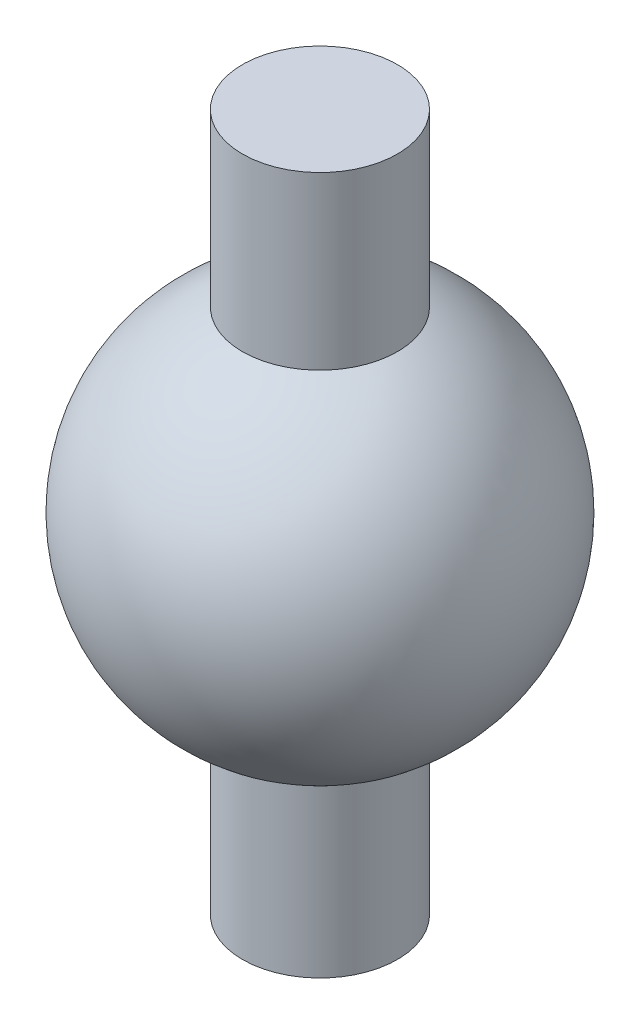
ISO-10303-21;
HEADER;
FILE_DESCRIPTION(('STEP AP214'),'2;1');
FILE_NAME('part.step','',(''),(''),'','','');
FILE_SCHEMA(('AUTOMOTIVE_DESIGN { 1 0 10303 214 1 1 1 1 }'));
ENDSEC;
DATA;
#1=APPLICATION_CONTEXT('core data for automotive mechanical design processes');
#2=APPLICATION_PROTOCOL_DEFINITION('international standard','automotive_design',2000,#1);
#3=PRODUCT_CONTEXT('',#1,'mechanical');
#4=PRODUCT('Part','Part','',(#3));
#5=PRODUCT_RELATED_PRODUCT_CATEGORY('part','',(#4));
#6=PRODUCT_DEFINITION_FORMATION('','',#4);
#7=PRODUCT_DEFINITION_CONTEXT('part definition',#1,'design');
#8=PRODUCT_DEFINITION('design','',#6,#7);
#9=PRODUCT_DEFINITION_SHAPE('','',#8);
#10=(LENGTH_UNIT() NAMED_UNIT(*) SI_UNIT(.MILLI.,.METRE.));
#11=(NAMED_UNIT(*) PLANE_ANGLE_UNIT() SI_UNIT($,.RADIAN.));
#12=(NAMED_UNIT(*) SI_UNIT($,.STERADIAN.) SOLID_ANGLE_UNIT());
#13=UNCERTAINTY_MEASURE_WITH_UNIT(LENGTH_MEASURE(1.E-05),#10,'distance_accuracy_value','');
#14=(GEOMETRIC_REPRESENTATION_CONTEXT(3) GLOBAL_UNCERTAINTY_ASSIGNED_CONTEXT((#13)) GLOBAL_UNIT_ASSIGNED_CONTEXT((#10,
#11,#12)) REPRESENTATION_CONTEXT('',''));
#15=CARTESIAN_POINT('',(0.,0.,0.));
#16=DIRECTION('',(0.,0.,1.));
#17=DIRECTION('',(1.,0.,0.));
#18=AXIS2_PLACEMENT_3D('',#15,#16,#17);
#19=CARTESIAN_POINT('',(0.,121.79987629617,88.9642108401669));
#20=DIRECTION('',(0.,1.,0.));
#21=DIRECTION('',(0.,0.,1.));
#22=AXIS2_PLACEMENT_3D('',#19,#20,#21);
#23=SPHERICAL_SURFACE('',#22,12.5);
#24=CARTESIAN_POINT('',(0.,110.34343705878,88.9642108401669));
#25=DIRECTION('',(0.,1.,0.));
#26=DIRECTION('',(0.,0.,1.));
#27=AXIS2_PLACEMENT_3D('',#24,#25,#26);
#28=CIRCLE('',#27,5.);
#29=CARTESIAN_POINT('',(0.,110.34343705878,93.9642108401669));
#30=VERTEX_POINT('',#29);
#31=EDGE_CURVE('E10',#30,#30,#28,.T.);
#32=CARTESIAN_POINT('',(0.,133.25631553356,88.9642108401669));
#33=DIRECTION('',(0.,1.,0.));
#34=DIRECTION('',(0.,0.,1.));
#35=AXIS2_PLACEMENT_3D('',#32,#33,#34);
#36=CIRCLE('',#35,5.);
#37=CARTESIAN_POINT('',(0.,133.25631553356,93.9642108401669));
#38=VERTEX_POINT('',#37);
#39=EDGE_CURVE('E53',#38,#38,#36,.T.);
#40=CARTESIAN_POINT('',(0.,110.34343705878,93.9642108401669));
#41=CARTESIAN_POINT('',(0.,110.464177068557,94.2409123694653));
#42=CARTESIAN_POINT('',(0.,110.594976930036,94.5132205987094));
#43=CARTESIAN_POINT('',(0.,110.8759299001,95.047663642605));
#44=CARTESIAN_POINT('',(0.,111.026083008685,95.3097984572565));
#45=CARTESIAN_POINT('',(0.,111.344976016662,95.8225078574837));
#46=CARTESIAN_POINT('',(0.,111.513715916053,96.0730824430592));
#47=CARTESIAN_POINT('',(0.,111.868891305023,96.5613595363628));
#48=CARTESIAN_POINT('',(0.,112.055326794602,96.7990620440908));
#49=CARTESIAN_POINT('',(0.,112.444916598327,97.2603468453887));
#50=CARTESIAN_POINT('',(0.,112.648070912474,97.4839291389586));
#51=CARTESIAN_POINT('',(0.,113.070031915222,97.91580049741));
#52=CARTESIAN_POINT('',(0.,113.288838603823,98.1240895622916));
#53=CARTESIAN_POINT('',(0.,113.74095629418,98.5242814237394));
#54=CARTESIAN_POINT('',(0.,113.974267295935,98.7161842203057));
#55=CARTESIAN_POINT('',(0.,114.45416930072,99.0825965649633));
#56=CARTESIAN_POINT('',(0.,114.700760303749,99.2571061130546));
#57=CARTESIAN_POINT('',(0.,115.205928350961,99.5878162306311));
#58=CARTESIAN_POINT('',(0.,115.464505395144,99.7440168001163));
#59=CARTESIAN_POINT('',(0.,115.992288658606,100.037289310656));
#60=CARTESIAN_POINT('',(0.,116.261494877885,100.174361251709));
#61=CARTESIAN_POINT('',(0.,116.809123852371,100.428657230206));
#62=CARTESIAN_POINT('',(0.,117.087546607578,100.54588126765));
#63=CARTESIAN_POINT('',(0.,117.652147650937,100.759866314532));
#64=CARTESIAN_POINT('',(0.,117.938325939088,100.856627323972));
#65=CARTESIAN_POINT('',(0.,118.516936348961,101.029178568581));
#66=CARTESIAN_POINT('',(0.,118.809368470682,101.10496880375));
#67=CARTESIAN_POINT('',(0.,119.398952031737,101.235180796167));
#68=CARTESIAN_POINT('',(0.,119.696103471071,101.289602553414));
#69=CARTESIAN_POINT('',(0.,120.293566387139,101.376792015836));
#70=CARTESIAN_POINT('',(0.,120.593877863873,101.40955972101));
#71=CARTESIAN_POINT('',(0.,121.196084992461,101.453269133176));
#72=CARTESIAN_POINT('',(0.,121.497980644316,101.464210840167));
#73=CARTESIAN_POINT('',(0.,122.101771948024,101.464210840167));
#74=CARTESIAN_POINT('',(0.,122.403667599879,101.453269133176));
#75=CARTESIAN_POINT('',(0.,123.005874728467,101.40955972101));
#76=CARTESIAN_POINT('',(0.,123.306186205201,101.376792015836));
#77=CARTESIAN_POINT('',(0.,123.903649121269,101.289602553414));
#78=CARTESIAN_POINT('',(0.,124.200800560603,101.235180796167));
#79=CARTESIAN_POINT('',(0.,124.790384121658,101.10496880375));
#80=CARTESIAN_POINT('',(0.,125.082816243379,101.029178568581));
#81=CARTESIAN_POINT('',(0.,125.661426653252,100.856627323972));
#82=CARTESIAN_POINT('',(0.,125.947604941403,100.759866314532));
#83=CARTESIAN_POINT('',(0.,126.512205984762,100.54588126765));
#84=CARTESIAN_POINT('',(0.,126.790628739969,100.428657230207));
#85=CARTESIAN_POINT('',(0.,127.338257714455,100.174361251709));
#86=CARTESIAN_POINT('',(0.,127.607463933734,100.037289310656));
#87=CARTESIAN_POINT('',(0.,128.135247197196,99.7440168001163));
#88=CARTESIAN_POINT('',(0.,128.393824241379,99.5878162306311));
#89=CARTESIAN_POINT('',(0.,128.898992288591,99.2571061130546));
#90=CARTESIAN_POINT('',(0.,129.14558329162,99.0825965649633));
#91=CARTESIAN_POINT('',(0.,129.625485296405,98.7161842203057));
#92=CARTESIAN_POINT('',(0.,129.85879629816,98.5242814237394));
#93=CARTESIAN_POINT('',(0.,130.310913988517,98.1240895622916));
#94=CARTESIAN_POINT('',(0.,130.529720677118,97.9158004974101));
#95=CARTESIAN_POINT('',(0.,130.951681679866,97.4839291389586));
#96=CARTESIAN_POINT('',(0.,131.154835994013,97.2603468453887));
#97=CARTESIAN_POINT('',(0.,131.544425797738,96.7990620440908));
#98=CARTESIAN_POINT('',(0.,131.730861287317,96.5613595363628));
#99=CARTESIAN_POINT('',(0.,132.086036676287,96.0730824430593));
#100=CARTESIAN_POINT('',(0.,132.254776575678,95.8225078574837));
#101=CARTESIAN_POINT('',(0.,132.573669583655,95.3097984572566));
#102=CARTESIAN_POINT('',(0.,132.72382269224,95.047663642605));
#103=CARTESIAN_POINT('',(0.,133.004775662304,94.5132205987094));
#104=CARTESIAN_POINT('',(0.,133.135575523783,94.2409123694654));
#105=CARTESIAN_POINT('',(0.,133.25631553356,93.9642108401669));
#106=B_SPLINE_CURVE_WITH_KNOTS('',3,(#40,#41,#42,#43,#44,#45,#46,#47,#48,#49,#50,#51,#52,#53,
#54,#55,#56,#57,#58,#59,#60,#61,#62,#63,#64,#65,#66,#67,#68,#69,#70,#71,#72,#73,#74,#75,#76,#77,
#78,#79,#80,#81,#82,#83,#84,#85,#86,#87,#88,#89,#90,#91,#92,#93,#94,#95,#96,#97,#98,#99,#100,
#101,#102,#103,#104,#105),.UNSPECIFIED.,.F.,.F.,(4,2,2,2,2,2,2,2,2,2,2,2,2,2,2,2,2,2,2,2,2,2,2,
2,2,2,2,2,2,2,2,2,4),(0.,0.905488998744916,1.81097799748983,2.71646699623474,3.62195599497966,
4.52744499372457,5.43293399246948,6.33842299121439,7.2439119899593,8.14940098870421,
9.05488998744913,9.96037898619403,10.865867984939,11.7713569836839,12.6768459824288,
13.5823349811737,14.4878239799186,15.3933129786635,16.2988019774084,17.2042909761533,
18.1097799748982,19.0152689736432,19.9207579723881,20.826246971133,21.7317359698779,
22.6372249686228,23.5427139673677,24.4482029661126,25.3536919648575,26.2591809636024,
27.1646699623474,28.0701589610923,28.9756479598372),.UNSPECIFIED.);
#107=EDGE_CURVE('BSEAM32',#30,#38,#106,.T.);
#108=ORIENTED_EDGE('',*,*,#31,.T.);
#109=ORIENTED_EDGE('',*,*,#39,.F.);
#110=ORIENTED_EDGE('',*,*,#107,.T.);
#111=ORIENTED_EDGE('',*,*,#107,.F.);
#112=EDGE_LOOP('',(#108,#110,#109,#111));
#113=FACE_BOUND('',#112,.T.);
#114=ADVANCED_FACE('F32',(#113),#23,.T.);
#115=CARTESIAN_POINT('',(0.,144.29987629617,88.9642108401669));
#116=DIRECTION('',(0.,1.,0.));
#117=DIRECTION('',(0.,0.,1.));
#118=AXIS2_PLACEMENT_3D('',#115,#116,#117);
#119=CYLINDRICAL_SURFACE('',#118,5.);
#120=CARTESIAN_POINT('',(0.,99.29987629617,88.9642108401669));
#121=DIRECTION('',(0.,1.,0.));
#122=DIRECTION('',(0.,0.,1.));
#123=AXIS2_PLACEMENT_3D('',#120,#121,#122);
#124=CIRCLE('',#123,5.);
#125=CARTESIAN_POINT('',(0.,99.29987629617,93.9642108401669));
#126=VERTEX_POINT('',#125);
#127=EDGE_CURVE('E39',#126,#126,#124,.T.);
#128=ORIENTED_EDGE('',*,*,#127,.T.);
#129=EDGE_LOOP('',(#128));
#130=FACE_BOUND('',#129,.T.);
#131=ORIENTED_EDGE('',*,*,#31,.F.);
#132=EDGE_LOOP('',(#131));
#133=FACE_BOUND('',#132,.T.);
#134=ADVANCED_FACE('F65',(#130,#133),#119,.T.);
#135=CARTESIAN_POINT('',(0.,99.29987629617,0.));
#136=DIRECTION('',(0.,1.,0.));
#137=DIRECTION('',(0.,0.,1.));
#138=AXIS2_PLACEMENT_3D('',#135,#136,#137);
#139=PLANE('',#138);
#140=ORIENTED_EDGE('',*,*,#127,.F.);
#141=EDGE_LOOP('',(#140));
#142=FACE_BOUND('',#141,.T.);
#143=ADVANCED_FACE('F69',(#142),#139,.F.);
#144=CARTESIAN_POINT('',(0.,144.29987629617,0.));
#145=DIRECTION('',(0.,1.,0.));
#146=DIRECTION('',(0.,0.,1.));
#147=AXIS2_PLACEMENT_3D('',#144,#145,#146);
#148=PLANE('',#147);
#149=CARTESIAN_POINT('',(0.,144.29987629617,88.9642108401669));
#150=DIRECTION('',(0.,1.,0.));
#151=DIRECTION('',(0.,0.,1.));
#152=AXIS2_PLACEMENT_3D('',#149,#150,#151);
#153=CIRCLE('',#152,5.);
#154=CARTESIAN_POINT('',(0.,144.29987629617,93.9642108401669));
#155=VERTEX_POINT('',#154);
#156=EDGE_CURVE('E46',#155,#155,#153,.T.);
#157=ORIENTED_EDGE('',*,*,#156,.T.);
#158=EDGE_LOOP('',(#157));
#159=FACE_BOUND('',#158,.T.);
#160=ADVANCED_FACE('F72',(#159),#148,.T.);
#161=CARTESIAN_POINT('',(0.,144.29987629617,88.9642108401669));
#162=DIRECTION('',(0.,1.,0.));
#163=DIRECTION('',(0.,0.,1.));
#164=AXIS2_PLACEMENT_3D('',#161,#162,#163);
#165=CYLINDRICAL_SURFACE('',#164,5.);
#166=ORIENTED_EDGE('',*,*,#39,.T.);
#167=EDGE_LOOP('',(#166));
#168=FACE_BOUND('',#167,.T.);
#169=ORIENTED_EDGE('',*,*,#156,.F.);
#170=EDGE_LOOP('',(#169));
#171=FACE_BOUND('',#170,.T.);
#172=ADVANCED_FACE('F61',(#168,#171),#165,.T.);
#173=CLOSED_SHELL('',(#114,#134,#143,#160,#172));
#174=MANIFOLD_SOLID_BREP('B2',#173);
#175=ADVANCED_BREP_SHAPE_REPRESENTATION('',(#18,#174),#14);
#176=SHAPE_DEFINITION_REPRESENTATION(#9,#175);
ENDSEC;
END-ISO-10303-21;
